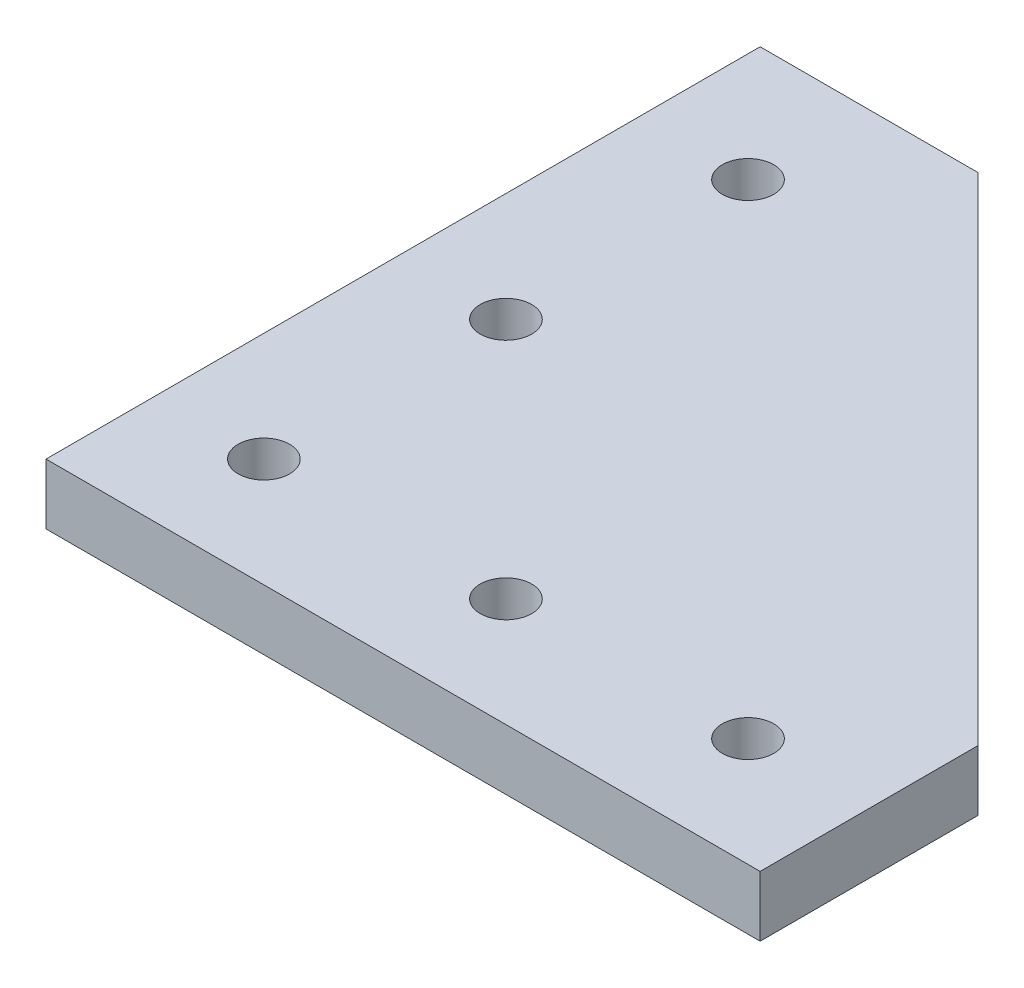
ISO-10303-21;
HEADER;
FILE_DESCRIPTION(('STEP AP214'),'2;1');
FILE_NAME('part.step','',(''),(''),'','','');
FILE_SCHEMA(('AUTOMOTIVE_DESIGN { 1 0 10303 214 1 1 1 1 }'));
ENDSEC;
DATA;
#1=APPLICATION_CONTEXT('core data for automotive mechanical design processes');
#2=APPLICATION_PROTOCOL_DEFINITION('international standard','automotive_design',2000,#1);
#3=PRODUCT_CONTEXT('',#1,'mechanical');
#4=PRODUCT('Part','Part','',(#3));
#5=PRODUCT_RELATED_PRODUCT_CATEGORY('part','',(#4));
#6=PRODUCT_DEFINITION_FORMATION('','',#4);
#7=PRODUCT_DEFINITION_CONTEXT('part definition',#1,'design');
#8=PRODUCT_DEFINITION('design','',#6,#7);
#9=PRODUCT_DEFINITION_SHAPE('','',#8);
#10=(LENGTH_UNIT() NAMED_UNIT(*) SI_UNIT(.MILLI.,.METRE.));
#11=(NAMED_UNIT(*) PLANE_ANGLE_UNIT() SI_UNIT($,.RADIAN.));
#12=(NAMED_UNIT(*) SI_UNIT($,.STERADIAN.) SOLID_ANGLE_UNIT());
#13=UNCERTAINTY_MEASURE_WITH_UNIT(LENGTH_MEASURE(1.E-05),#10,'distance_accuracy_value','');
#14=(GEOMETRIC_REPRESENTATION_CONTEXT(3) GLOBAL_UNCERTAINTY_ASSIGNED_CONTEXT((#13)) GLOBAL_UNIT_ASSIGNED_CONTEXT((#10,
#11,#12)) REPRESENTATION_CONTEXT('',''));
#15=CARTESIAN_POINT('',(0.,0.,0.));
#16=DIRECTION('',(0.,0.,1.));
#17=DIRECTION('',(1.,0.,0.));
#18=AXIS2_PLACEMENT_3D('',#15,#16,#17);
#19=CARTESIAN_POINT('',(0.,10.,0.));
#20=DIRECTION('',(0.,-1.,0.));
#21=DIRECTION('',(0.,0.,-1.));
#22=AXIS2_PLACEMENT_3D('',#19,#20,#21);
#23=PLANE('',#22);
#24=DIRECTION('',(0.,0.,1.));
#25=VECTOR('',#24,1.);
#26=CARTESIAN_POINT('',(-59.,10.,59.));
#27=LINE('',#26,#25);
#28=CARTESIAN_POINT('',(-59.,10.,-59.));
#29=VERTEX_POINT('',#28);
#30=CARTESIAN_POINT('',(-59.,10.,59.));
#31=VERTEX_POINT('',#30);
#32=EDGE_CURVE('E133',#29,#31,#27,.T.);
#33=ORIENTED_EDGE('',*,*,#32,.T.);
#34=DIRECTION('',(1.,0.,0.));
#35=VECTOR('',#34,1.);
#36=CARTESIAN_POINT('',(-59.,10.,59.));
#37=LINE('',#36,#35);
#38=CARTESIAN_POINT('',(59.,10.,59.));
#39=VERTEX_POINT('',#38);
#40=EDGE_CURVE('E91',#31,#39,#37,.T.);
#41=ORIENTED_EDGE('',*,*,#40,.T.);
#42=DIRECTION('',(0.,0.,-1.));
#43=VECTOR('',#42,1.);
#44=CARTESIAN_POINT('',(59.,10.,59.));
#45=LINE('',#44,#43);
#46=CARTESIAN_POINT('',(59.,10.,23.));
#47=VERTEX_POINT('',#46);
#48=EDGE_CURVE('E95',#39,#47,#45,.T.);
#49=ORIENTED_EDGE('',*,*,#48,.T.);
#50=DIRECTION('',(-0.707106781186548,0.,-0.707106781186548));
#51=VECTOR('',#50,1.);
#52=CARTESIAN_POINT('',(-23.,10.,-59.));
#53=LINE('',#52,#51);
#54=CARTESIAN_POINT('',(-23.,10.,-59.));
#55=VERTEX_POINT('',#54);
#56=EDGE_CURVE('E99',#47,#55,#53,.T.);
#57=ORIENTED_EDGE('',*,*,#56,.T.);
#58=DIRECTION('',(-1.,0.,0.));
#59=VECTOR('',#58,1.);
#60=CARTESIAN_POINT('',(-59.,10.,-59.));
#61=LINE('',#60,#59);
#62=EDGE_CURVE('E57',#55,#29,#61,.T.);
#63=ORIENTED_EDGE('',*,*,#62,.T.);
#64=EDGE_LOOP('',(#33,#41,#49,#57,#63));
#65=FACE_BOUND('',#64,.T.);
#66=CARTESIAN_POINT('',(-41.,10.,41.));
#67=DIRECTION('',(0.,1.,0.));
#68=DIRECTION('',(0.,0.,1.));
#69=AXIS2_PLACEMENT_3D('',#66,#67,#68);
#70=CIRCLE('',#69,4.25000000000001);
#71=CARTESIAN_POINT('',(-41.,10.,45.25));
#72=VERTEX_POINT('',#71);
#73=EDGE_CURVE('E124',#72,#72,#70,.T.);
#74=ORIENTED_EDGE('',*,*,#73,.F.);
#75=EDGE_LOOP('',(#74));
#76=FACE_BOUND('',#75,.T.);
#77=CARTESIAN_POINT('',(-1.00000000000001,10.,41.));
#78=DIRECTION('',(0.,1.,0.));
#79=DIRECTION('',(0.,0.,1.));
#80=AXIS2_PLACEMENT_3D('',#77,#78,#79);
#81=CIRCLE('',#80,4.25);
#82=CARTESIAN_POINT('',(-1.00000000000001,10.,45.25));
#83=VERTEX_POINT('',#82);
#84=EDGE_CURVE('E211',#83,#83,#81,.T.);
#85=ORIENTED_EDGE('',*,*,#84,.F.);
#86=EDGE_LOOP('',(#85));
#87=FACE_BOUND('',#86,.T.);
#88=CARTESIAN_POINT('',(39.,10.,41.));
#89=DIRECTION('',(0.,1.,0.));
#90=DIRECTION('',(0.,0.,1.));
#91=AXIS2_PLACEMENT_3D('',#88,#89,#90);
#92=CIRCLE('',#91,4.25);
#93=CARTESIAN_POINT('',(39.,10.,45.25));
#94=VERTEX_POINT('',#93);
#95=EDGE_CURVE('E203',#94,#94,#92,.T.);
#96=ORIENTED_EDGE('',*,*,#95,.F.);
#97=EDGE_LOOP('',(#96));
#98=FACE_BOUND('',#97,.T.);
#99=CARTESIAN_POINT('',(-41.,10.,0.999999999999994));
#100=DIRECTION('',(0.,1.,0.));
#101=DIRECTION('',(0.,0.,1.));
#102=AXIS2_PLACEMENT_3D('',#99,#100,#101);
#103=CIRCLE('',#102,4.25000000000001);
#104=CARTESIAN_POINT('',(-41.,10.,5.25));
#105=VERTEX_POINT('',#104);
#106=EDGE_CURVE('E195',#105,#105,#103,.T.);
#107=ORIENTED_EDGE('',*,*,#106,.F.);
#108=EDGE_LOOP('',(#107));
#109=FACE_BOUND('',#108,.T.);
#110=CARTESIAN_POINT('',(-41.,10.,-39.));
#111=DIRECTION('',(0.,1.,0.));
#112=DIRECTION('',(0.,0.,1.));
#113=AXIS2_PLACEMENT_3D('',#110,#111,#112);
#114=CIRCLE('',#113,4.25000000000001);
#115=CARTESIAN_POINT('',(-41.,10.,-34.75));
#116=VERTEX_POINT('',#115);
#117=EDGE_CURVE('E184',#116,#116,#114,.T.);
#118=ORIENTED_EDGE('',*,*,#117,.F.);
#119=EDGE_LOOP('',(#118));
#120=FACE_BOUND('',#119,.T.);
#121=ADVANCED_FACE('F39',(#65,#76,#87,#98,#109,#120),#23,.F.);
#122=CARTESIAN_POINT('',(0.,0.,0.));
#123=DIRECTION('',(0.,-1.,0.));
#124=DIRECTION('',(0.,0.,-1.));
#125=AXIS2_PLACEMENT_3D('',#122,#123,#124);
#126=PLANE('',#125);
#127=CARTESIAN_POINT('',(-41.,0.,0.999999999999994));
#128=DIRECTION('',(0.,1.,0.));
#129=DIRECTION('',(0.,0.,1.));
#130=AXIS2_PLACEMENT_3D('',#127,#128,#129);
#131=CIRCLE('',#130,4.25000000000001);
#132=CARTESIAN_POINT('',(-41.,0.,5.25));
#133=VERTEX_POINT('',#132);
#134=EDGE_CURVE('E192',#133,#133,#131,.T.);
#135=ORIENTED_EDGE('',*,*,#134,.T.);
#136=EDGE_LOOP('',(#135));
#137=FACE_BOUND('',#136,.T.);
#138=CARTESIAN_POINT('',(-1.00000000000001,0.,41.));
#139=DIRECTION('',(0.,1.,0.));
#140=DIRECTION('',(0.,0.,1.));
#141=AXIS2_PLACEMENT_3D('',#138,#139,#140);
#142=CIRCLE('',#141,4.25);
#143=CARTESIAN_POINT('',(-1.00000000000001,0.,45.25));
#144=VERTEX_POINT('',#143);
#145=EDGE_CURVE('E207',#144,#144,#142,.T.);
#146=ORIENTED_EDGE('',*,*,#145,.T.);
#147=EDGE_LOOP('',(#146));
#148=FACE_BOUND('',#147,.T.);
#149=DIRECTION('',(0.,0.,1.));
#150=VECTOR('',#149,1.);
#151=CARTESIAN_POINT('',(-59.,0.,59.));
#152=LINE('',#151,#150);
#153=CARTESIAN_POINT('',(-59.,0.,-59.));
#154=VERTEX_POINT('',#153);
#155=CARTESIAN_POINT('',(-59.,0.,59.));
#156=VERTEX_POINT('',#155);
#157=EDGE_CURVE('E119',#154,#156,#152,.T.);
#158=ORIENTED_EDGE('',*,*,#157,.F.);
#159=DIRECTION('',(-1.,0.,0.));
#160=VECTOR('',#159,1.);
#161=CARTESIAN_POINT('',(-59.,0.,-59.));
#162=LINE('',#161,#160);
#163=CARTESIAN_POINT('',(-23.,0.,-59.));
#164=VERTEX_POINT('',#163);
#165=EDGE_CURVE('E83',#164,#154,#162,.T.);
#166=ORIENTED_EDGE('',*,*,#165,.F.);
#167=DIRECTION('',(-0.707106781186548,0.,-0.707106781186548));
#168=VECTOR('',#167,1.);
#169=CARTESIAN_POINT('',(-23.,0.,-59.));
#170=LINE('',#169,#168);
#171=CARTESIAN_POINT('',(59.,0.,23.));
#172=VERTEX_POINT('',#171);
#173=EDGE_CURVE('E77',#172,#164,#170,.T.);
#174=ORIENTED_EDGE('',*,*,#173,.F.);
#175=DIRECTION('',(0.,0.,-1.));
#176=VECTOR('',#175,1.);
#177=CARTESIAN_POINT('',(59.,0.,59.));
#178=LINE('',#177,#176);
#179=CARTESIAN_POINT('',(59.,0.,59.));
#180=VERTEX_POINT('',#179);
#181=EDGE_CURVE('E107',#180,#172,#178,.T.);
#182=ORIENTED_EDGE('',*,*,#181,.F.);
#183=DIRECTION('',(1.,0.,0.));
#184=VECTOR('',#183,1.);
#185=CARTESIAN_POINT('',(-59.,0.,59.));
#186=LINE('',#185,#184);
#187=EDGE_CURVE('E123',#156,#180,#186,.T.);
#188=ORIENTED_EDGE('',*,*,#187,.F.);
#189=EDGE_LOOP('',(#158,#166,#174,#182,#188));
#190=FACE_BOUND('',#189,.T.);
#191=CARTESIAN_POINT('',(-41.,0.,41.));
#192=DIRECTION('',(0.,1.,0.));
#193=DIRECTION('',(0.,0.,1.));
#194=AXIS2_PLACEMENT_3D('',#191,#192,#193);
#195=CIRCLE('',#194,4.25000000000001);
#196=CARTESIAN_POINT('',(-41.,0.,45.25));
#197=VERTEX_POINT('',#196);
#198=EDGE_CURVE('E215',#197,#197,#195,.T.);
#199=ORIENTED_EDGE('',*,*,#198,.T.);
#200=EDGE_LOOP('',(#199));
#201=FACE_BOUND('',#200,.T.);
#202=CARTESIAN_POINT('',(39.,0.,41.));
#203=DIRECTION('',(0.,1.,0.));
#204=DIRECTION('',(0.,0.,1.));
#205=AXIS2_PLACEMENT_3D('',#202,#203,#204);
#206=CIRCLE('',#205,4.25);
#207=CARTESIAN_POINT('',(39.,0.,45.25));
#208=VERTEX_POINT('',#207);
#209=EDGE_CURVE('E199',#208,#208,#206,.T.);
#210=ORIENTED_EDGE('',*,*,#209,.T.);
#211=EDGE_LOOP('',(#210));
#212=FACE_BOUND('',#211,.T.);
#213=CARTESIAN_POINT('',(-41.,0.,-39.));
#214=DIRECTION('',(0.,1.,0.));
#215=DIRECTION('',(0.,0.,1.));
#216=AXIS2_PLACEMENT_3D('',#213,#214,#215);
#217=CIRCLE('',#216,4.25000000000001);
#218=CARTESIAN_POINT('',(-41.,0.,-34.75));
#219=VERTEX_POINT('',#218);
#220=EDGE_CURVE('E187',#219,#219,#217,.T.);
#221=ORIENTED_EDGE('',*,*,#220,.T.);
#222=EDGE_LOOP('',(#221));
#223=FACE_BOUND('',#222,.T.);
#224=ADVANCED_FACE('F140',(#137,#148,#190,#201,#212,#223),#126,.T.);
#225=CARTESIAN_POINT('',(-59.,10.,59.));
#226=DIRECTION('',(1.,0.,0.));
#227=DIRECTION('',(0.,0.,-1.));
#228=AXIS2_PLACEMENT_3D('',#225,#226,#227);
#229=PLANE('',#228);
#230=ORIENTED_EDGE('',*,*,#157,.T.);
#231=DIRECTION('',(0.,-1.,0.));
#232=VECTOR('',#231,1.);
#233=CARTESIAN_POINT('',(-59.,10.,59.));
#234=LINE('',#233,#232);
#235=EDGE_CURVE('E11',#31,#156,#234,.T.);
#236=ORIENTED_EDGE('',*,*,#235,.F.);
#237=ORIENTED_EDGE('',*,*,#32,.F.);
#238=DIRECTION('',(0.,-1.,0.));
#239=VECTOR('',#238,1.);
#240=CARTESIAN_POINT('',(-59.,10.,-59.));
#241=LINE('',#240,#239);
#242=EDGE_CURVE('E115',#29,#154,#241,.T.);
#243=ORIENTED_EDGE('',*,*,#242,.T.);
#244=EDGE_LOOP('',(#230,#236,#237,#243));
#245=FACE_BOUND('',#244,.T.);
#246=ADVANCED_FACE('F41',(#245),#229,.F.);
#247=CARTESIAN_POINT('',(-59.,10.,59.));
#248=DIRECTION('',(0.,0.,-1.));
#249=DIRECTION('',(-1.,0.,0.));
#250=AXIS2_PLACEMENT_3D('',#247,#248,#249);
#251=PLANE('',#250);
#252=ORIENTED_EDGE('',*,*,#187,.T.);
#253=DIRECTION('',(0.,-1.,0.));
#254=VECTOR('',#253,1.);
#255=CARTESIAN_POINT('',(59.,10.,59.));
#256=LINE('',#255,#254);
#257=EDGE_CURVE('E49',#39,#180,#256,.T.);
#258=ORIENTED_EDGE('',*,*,#257,.F.);
#259=ORIENTED_EDGE('',*,*,#40,.F.);
#260=ORIENTED_EDGE('',*,*,#235,.T.);
#261=EDGE_LOOP('',(#252,#258,#259,#260));
#262=FACE_BOUND('',#261,.T.);
#263=ADVANCED_FACE('F280',(#262),#251,.F.);
#264=CARTESIAN_POINT('',(59.,10.,59.));
#265=DIRECTION('',(-1.,0.,0.));
#266=DIRECTION('',(0.,0.,1.));
#267=AXIS2_PLACEMENT_3D('',#264,#265,#266);
#268=PLANE('',#267);
#269=ORIENTED_EDGE('',*,*,#181,.T.);
#270=DIRECTION('',(0.,-1.,0.));
#271=VECTOR('',#270,1.);
#272=CARTESIAN_POINT('',(59.,10.,23.));
#273=LINE('',#272,#271);
#274=EDGE_CURVE('E104',#47,#172,#273,.T.);
#275=ORIENTED_EDGE('',*,*,#274,.F.);
#276=ORIENTED_EDGE('',*,*,#48,.F.);
#277=ORIENTED_EDGE('',*,*,#257,.T.);
#278=EDGE_LOOP('',(#269,#275,#276,#277));
#279=FACE_BOUND('',#278,.T.);
#280=ADVANCED_FACE('F105',(#279),#268,.F.);
#281=CARTESIAN_POINT('',(-23.,10.,-59.));
#282=DIRECTION('',(-0.707106781186548,0.,0.707106781186548));
#283=DIRECTION('',(0.707106781186548,0.,0.707106781186548));
#284=AXIS2_PLACEMENT_3D('',#281,#282,#283);
#285=PLANE('',#284);
#286=ORIENTED_EDGE('',*,*,#173,.T.);
#287=DIRECTION('',(0.,-1.,0.));
#288=VECTOR('',#287,1.);
#289=CARTESIAN_POINT('',(-23.,10.,-59.));
#290=LINE('',#289,#288);
#291=EDGE_CURVE('E109',#55,#164,#290,.T.);
#292=ORIENTED_EDGE('',*,*,#291,.F.);
#293=ORIENTED_EDGE('',*,*,#56,.F.);
#294=ORIENTED_EDGE('',*,*,#274,.T.);
#295=EDGE_LOOP('',(#286,#292,#293,#294));
#296=FACE_BOUND('',#295,.T.);
#297=ADVANCED_FACE('F111',(#296),#285,.F.);
#298=CARTESIAN_POINT('',(-59.,10.,-59.));
#299=DIRECTION('',(0.,0.,1.));
#300=DIRECTION('',(1.,0.,0.));
#301=AXIS2_PLACEMENT_3D('',#298,#299,#300);
#302=PLANE('',#301);
#303=ORIENTED_EDGE('',*,*,#165,.T.);
#304=ORIENTED_EDGE('',*,*,#242,.F.);
#305=ORIENTED_EDGE('',*,*,#62,.F.);
#306=ORIENTED_EDGE('',*,*,#291,.T.);
#307=EDGE_LOOP('',(#303,#304,#305,#306));
#308=FACE_BOUND('',#307,.T.);
#309=ADVANCED_FACE('F145',(#308),#302,.F.);
#310=CARTESIAN_POINT('',(-41.,10.,41.));
#311=DIRECTION('',(0.,-1.,0.));
#312=DIRECTION('',(0.,0.,-1.));
#313=AXIS2_PLACEMENT_3D('',#310,#311,#312);
#314=CYLINDRICAL_SURFACE('',#313,4.25000000000001);
#315=ORIENTED_EDGE('',*,*,#73,.T.);
#316=EDGE_LOOP('',(#315));
#317=FACE_BOUND('',#316,.T.);
#318=ORIENTED_EDGE('',*,*,#198,.F.);
#319=EDGE_LOOP('',(#318));
#320=FACE_BOUND('',#319,.T.);
#321=ADVANCED_FACE('F147',(#317,#320),#314,.F.);
#322=CARTESIAN_POINT('',(-1.00000000000001,10.,41.));
#323=DIRECTION('',(0.,-1.,0.));
#324=DIRECTION('',(0.,0.,-1.));
#325=AXIS2_PLACEMENT_3D('',#322,#323,#324);
#326=CYLINDRICAL_SURFACE('',#325,4.25);
#327=ORIENTED_EDGE('',*,*,#84,.T.);
#328=EDGE_LOOP('',(#327));
#329=FACE_BOUND('',#328,.T.);
#330=ORIENTED_EDGE('',*,*,#145,.F.);
#331=EDGE_LOOP('',(#330));
#332=FACE_BOUND('',#331,.T.);
#333=ADVANCED_FACE('F153',(#329,#332),#326,.F.);
#334=CARTESIAN_POINT('',(39.,10.,41.));
#335=DIRECTION('',(0.,-1.,0.));
#336=DIRECTION('',(0.,0.,-1.));
#337=AXIS2_PLACEMENT_3D('',#334,#335,#336);
#338=CYLINDRICAL_SURFACE('',#337,4.25);
#339=ORIENTED_EDGE('',*,*,#95,.T.);
#340=EDGE_LOOP('',(#339));
#341=FACE_BOUND('',#340,.T.);
#342=ORIENTED_EDGE('',*,*,#209,.F.);
#343=EDGE_LOOP('',(#342));
#344=FACE_BOUND('',#343,.T.);
#345=ADVANCED_FACE('F167',(#341,#344),#338,.F.);
#346=CARTESIAN_POINT('',(-41.,10.,0.999999999999994));
#347=DIRECTION('',(0.,-1.,0.));
#348=DIRECTION('',(0.,0.,-1.));
#349=AXIS2_PLACEMENT_3D('',#346,#347,#348);
#350=CYLINDRICAL_SURFACE('',#349,4.25000000000001);
#351=ORIENTED_EDGE('',*,*,#106,.T.);
#352=EDGE_LOOP('',(#351));
#353=FACE_BOUND('',#352,.T.);
#354=ORIENTED_EDGE('',*,*,#134,.F.);
#355=EDGE_LOOP('',(#354));
#356=FACE_BOUND('',#355,.T.);
#357=ADVANCED_FACE('F171',(#353,#356),#350,.F.);
#358=CARTESIAN_POINT('',(-41.,10.,-39.));
#359=DIRECTION('',(0.,-1.,0.));
#360=DIRECTION('',(0.,0.,-1.));
#361=AXIS2_PLACEMENT_3D('',#358,#359,#360);
#362=CYLINDRICAL_SURFACE('',#361,4.25000000000001);
#363=ORIENTED_EDGE('',*,*,#117,.T.);
#364=EDGE_LOOP('',(#363));
#365=FACE_BOUND('',#364,.T.);
#366=ORIENTED_EDGE('',*,*,#220,.F.);
#367=EDGE_LOOP('',(#366));
#368=FACE_BOUND('',#367,.T.);
#369=ADVANCED_FACE('F175',(#365,#368),#362,.F.);
#370=CLOSED_SHELL('',(#121,#224,#246,#263,#280,#297,#309,#321,#333,#345,#357,#369));
#371=MANIFOLD_SOLID_BREP('B2',#370);
#372=ADVANCED_BREP_SHAPE_REPRESENTATION('',(#18,#371),#14);
#373=SHAPE_DEFINITION_REPRESENTATION(#9,#372);
ENDSEC;
END-ISO-10303-21;
